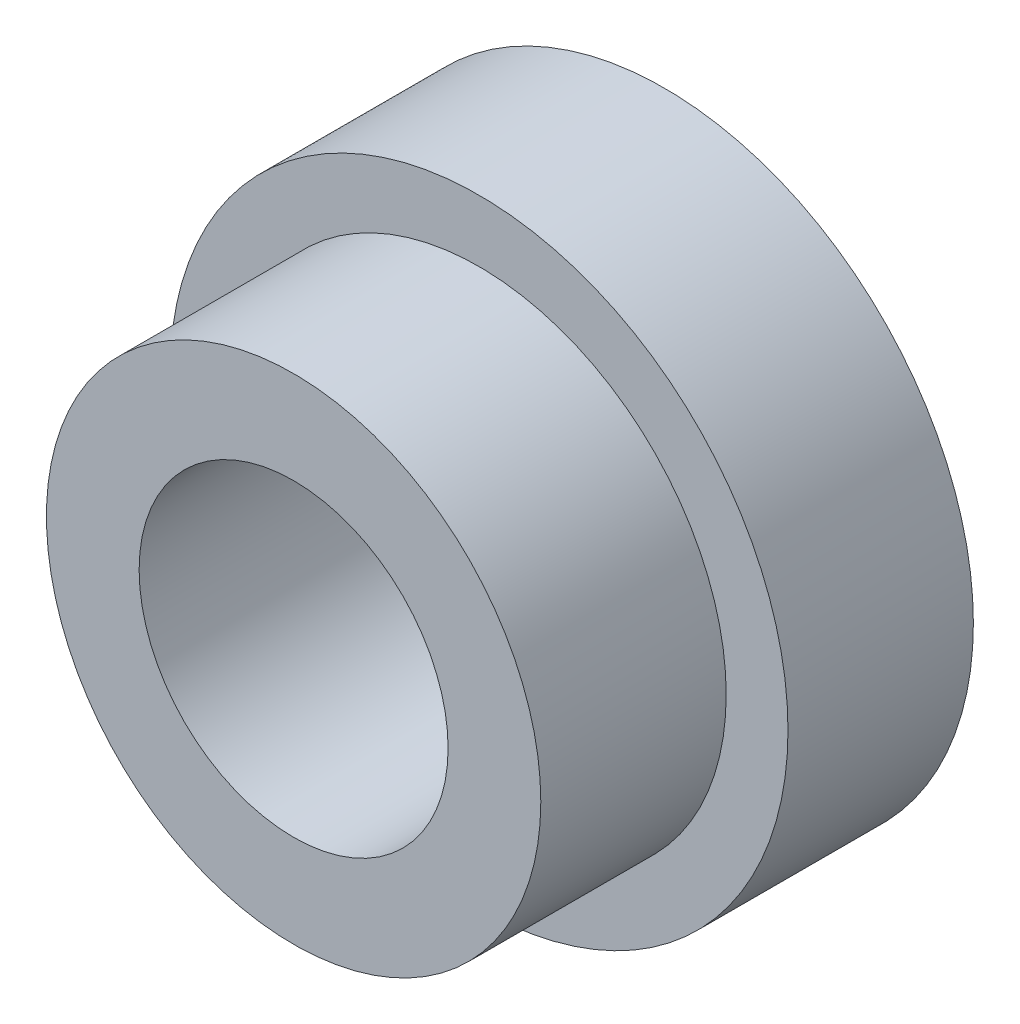
ISO-10303-21;
HEADER;
FILE_DESCRIPTION(('STEP AP214'),'2;1');
FILE_NAME('part.step','',(''),(''),'','','');
FILE_SCHEMA(('AUTOMOTIVE_DESIGN { 1 0 10303 214 1 1 1 1 }'));
ENDSEC;
DATA;
#1=APPLICATION_CONTEXT('core data for automotive mechanical design processes');
#2=APPLICATION_PROTOCOL_DEFINITION('international standard','automotive_design',2000,#1);
#3=PRODUCT_CONTEXT('',#1,'mechanical');
#4=PRODUCT('Part','Part','',(#3));
#5=PRODUCT_RELATED_PRODUCT_CATEGORY('part','',(#4));
#6=PRODUCT_DEFINITION_FORMATION('','',#4);
#7=PRODUCT_DEFINITION_CONTEXT('part definition',#1,'design');
#8=PRODUCT_DEFINITION('design','',#6,#7);
#9=PRODUCT_DEFINITION_SHAPE('','',#8);
#10=(LENGTH_UNIT() NAMED_UNIT(*) SI_UNIT(.MILLI.,.METRE.));
#11=(NAMED_UNIT(*) PLANE_ANGLE_UNIT() SI_UNIT($,.RADIAN.));
#12=(NAMED_UNIT(*) SI_UNIT($,.STERADIAN.) SOLID_ANGLE_UNIT());
#13=UNCERTAINTY_MEASURE_WITH_UNIT(LENGTH_MEASURE(1.E-05),#10,'distance_accuracy_value','');
#14=(GEOMETRIC_REPRESENTATION_CONTEXT(3) GLOBAL_UNCERTAINTY_ASSIGNED_CONTEXT((#13)) GLOBAL_UNIT_ASSIGNED_CONTEXT((#10,
#11,#12)) REPRESENTATION_CONTEXT('',''));
#15=CARTESIAN_POINT('',(0.,0.,0.));
#16=DIRECTION('',(0.,0.,1.));
#17=DIRECTION('',(1.,0.,0.));
#18=AXIS2_PLACEMENT_3D('',#15,#16,#17);
#19=CARTESIAN_POINT('',(0.,0.,3.));
#20=DIRECTION('',(0.,0.,-1.));
#21=DIRECTION('',(-1.,0.,0.));
#22=AXIS2_PLACEMENT_3D('',#19,#20,#21);
#23=CYLINDRICAL_SURFACE('',#22,5.);
#24=CARTESIAN_POINT('',(0.,0.,3.));
#25=DIRECTION('',(0.,0.,1.));
#26=DIRECTION('',(1.,0.,0.));
#27=AXIS2_PLACEMENT_3D('',#24,#25,#26);
#28=CIRCLE('',#27,5.);
#29=CARTESIAN_POINT('',(5.,0.,3.));
#30=VERTEX_POINT('',#29);
#31=EDGE_CURVE('E49',#30,#30,#28,.T.);
#32=ORIENTED_EDGE('',*,*,#31,.F.);
#33=EDGE_LOOP('',(#32));
#34=FACE_BOUND('',#33,.T.);
#35=CARTESIAN_POINT('',(0.,0.,0.));
#36=DIRECTION('',(0.,0.,1.));
#37=DIRECTION('',(1.,0.,0.));
#38=AXIS2_PLACEMENT_3D('',#35,#36,#37);
#39=CIRCLE('',#38,5.);
#40=CARTESIAN_POINT('',(5.,0.,0.));
#41=VERTEX_POINT('',#40);
#42=EDGE_CURVE('E44',#41,#41,#39,.T.);
#43=ORIENTED_EDGE('',*,*,#42,.T.);
#44=EDGE_LOOP('',(#43));
#45=FACE_BOUND('',#44,.T.);
#46=ADVANCED_FACE('F41',(#34,#45),#23,.T.);
#47=CARTESIAN_POINT('',(0.,0.,3.));
#48=DIRECTION('',(0.,0.,1.));
#49=DIRECTION('',(1.,0.,0.));
#50=AXIS2_PLACEMENT_3D('',#47,#48,#49);
#51=PLANE('',#50);
#52=CARTESIAN_POINT('',(0.,0.,3.));
#53=DIRECTION('',(0.,0.,1.));
#54=DIRECTION('',(1.,0.,0.));
#55=AXIS2_PLACEMENT_3D('',#52,#53,#54);
#56=CIRCLE('',#55,4.);
#57=CARTESIAN_POINT('',(4.,0.,3.));
#58=VERTEX_POINT('',#57);
#59=EDGE_CURVE('E10',#58,#58,#56,.T.);
#60=ORIENTED_EDGE('',*,*,#59,.F.);
#61=EDGE_LOOP('',(#60));
#62=FACE_BOUND('',#61,.T.);
#63=ORIENTED_EDGE('',*,*,#31,.T.);
#64=EDGE_LOOP('',(#63));
#65=FACE_BOUND('',#64,.T.);
#66=ADVANCED_FACE('F90',(#62,#65),#51,.T.);
#67=CARTESIAN_POINT('',(0.,0.,0.));
#68=DIRECTION('',(0.,0.,1.));
#69=DIRECTION('',(1.,0.,0.));
#70=AXIS2_PLACEMENT_3D('',#67,#68,#69);
#71=PLANE('',#70);
#72=CARTESIAN_POINT('',(0.,0.,0.));
#73=DIRECTION('',(0.,0.,1.));
#74=DIRECTION('',(1.,0.,0.));
#75=AXIS2_PLACEMENT_3D('',#72,#73,#74);
#76=CIRCLE('',#75,2.5);
#77=CARTESIAN_POINT('',(2.5,0.,0.));
#78=VERTEX_POINT('',#77);
#79=EDGE_CURVE('E60',#78,#78,#76,.T.);
#80=ORIENTED_EDGE('',*,*,#79,.T.);
#81=EDGE_LOOP('',(#80));
#82=FACE_BOUND('',#81,.T.);
#83=ORIENTED_EDGE('',*,*,#42,.F.);
#84=EDGE_LOOP('',(#83));
#85=FACE_BOUND('',#84,.T.);
#86=ADVANCED_FACE('F69',(#82,#85),#71,.F.);
#87=CARTESIAN_POINT('',(0.,0.,6.));
#88=DIRECTION('',(0.,0.,-1.));
#89=DIRECTION('',(-1.,0.,0.));
#90=AXIS2_PLACEMENT_3D('',#87,#88,#89);
#91=CYLINDRICAL_SURFACE('',#90,4.);
#92=CARTESIAN_POINT('',(0.,0.,6.));
#93=DIRECTION('',(0.,0.,1.));
#94=DIRECTION('',(1.,0.,0.));
#95=AXIS2_PLACEMENT_3D('',#92,#93,#94);
#96=CIRCLE('',#95,4.);
#97=CARTESIAN_POINT('',(4.,0.,6.));
#98=VERTEX_POINT('',#97);
#99=EDGE_CURVE('E56',#98,#98,#96,.T.);
#100=ORIENTED_EDGE('',*,*,#99,.F.);
#101=EDGE_LOOP('',(#100));
#102=FACE_BOUND('',#101,.T.);
#103=ORIENTED_EDGE('',*,*,#59,.T.);
#104=EDGE_LOOP('',(#103));
#105=FACE_BOUND('',#104,.T.);
#106=ADVANCED_FACE('F81',(#102,#105),#91,.T.);
#107=CARTESIAN_POINT('',(0.,0.,6.));
#108=DIRECTION('',(0.,0.,1.));
#109=DIRECTION('',(1.,0.,0.));
#110=AXIS2_PLACEMENT_3D('',#107,#108,#109);
#111=PLANE('',#110);
#112=CARTESIAN_POINT('',(0.,0.,6.));
#113=DIRECTION('',(0.,0.,1.));
#114=DIRECTION('',(1.,0.,0.));
#115=AXIS2_PLACEMENT_3D('',#112,#113,#114);
#116=CIRCLE('',#115,2.5);
#117=CARTESIAN_POINT('',(2.5,0.,6.));
#118=VERTEX_POINT('',#117);
#119=EDGE_CURVE('E61',#118,#118,#116,.T.);
#120=ORIENTED_EDGE('',*,*,#119,.F.);
#121=EDGE_LOOP('',(#120));
#122=FACE_BOUND('',#121,.T.);
#123=ORIENTED_EDGE('',*,*,#99,.T.);
#124=EDGE_LOOP('',(#123));
#125=FACE_BOUND('',#124,.T.);
#126=ADVANCED_FACE('F75',(#122,#125),#111,.T.);
#127=CARTESIAN_POINT('',(0.,0.,0.));
#128=DIRECTION('',(0.,0.,1.));
#129=DIRECTION('',(1.,0.,0.));
#130=AXIS2_PLACEMENT_3D('',#127,#128,#129);
#131=CYLINDRICAL_SURFACE('',#130,2.5);
#132=ORIENTED_EDGE('',*,*,#79,.F.);
#133=EDGE_LOOP('',(#132));
#134=FACE_BOUND('',#133,.T.);
#135=ORIENTED_EDGE('',*,*,#119,.T.);
#136=EDGE_LOOP('',(#135));
#137=FACE_BOUND('',#136,.T.);
#138=ADVANCED_FACE('F72',(#134,#137),#131,.F.);
#139=CLOSED_SHELL('',(#46,#66,#86,#106,#126,#138));
#140=MANIFOLD_SOLID_BREP('B2',#139);
#141=ADVANCED_BREP_SHAPE_REPRESENTATION('',(#18,#140),#14);
#142=SHAPE_DEFINITION_REPRESENTATION(#9,#141);
ENDSEC;
END-ISO-10303-21;
